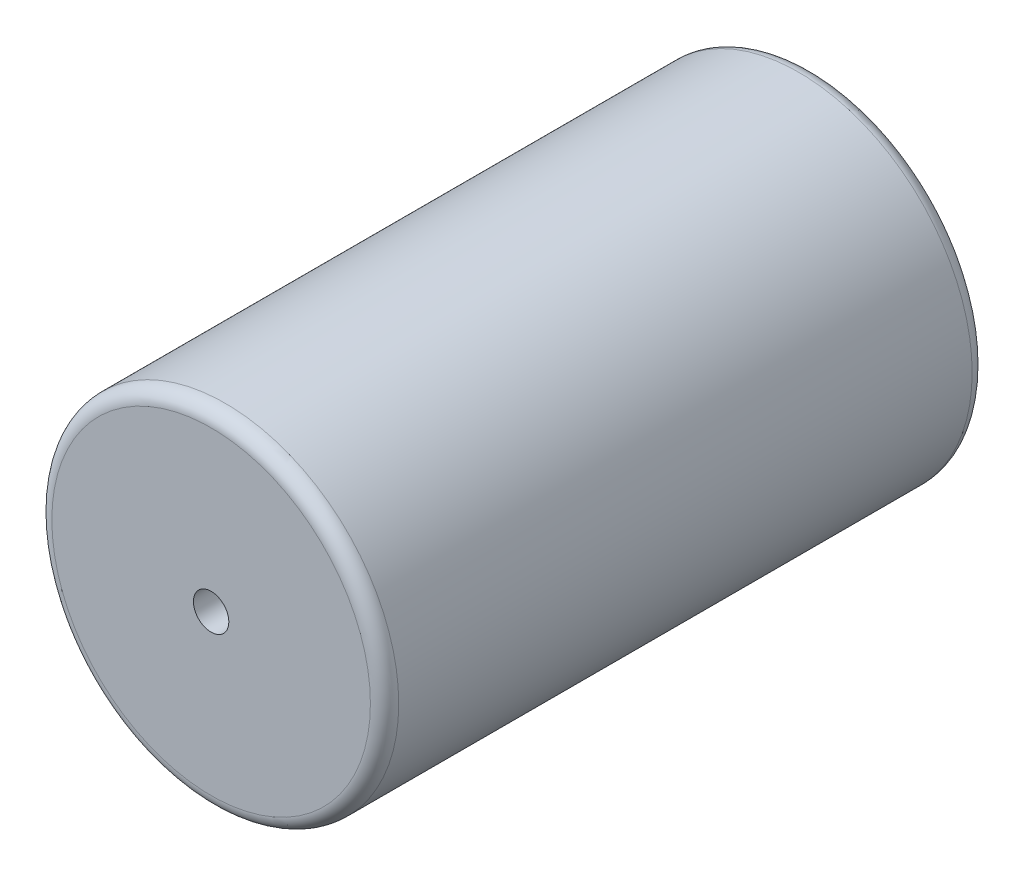
ISO-10303-21;
HEADER;
FILE_DESCRIPTION(('STEP AP214'),'2;1');
FILE_NAME('part.step','',(''),(''),'','','');
FILE_SCHEMA(('AUTOMOTIVE_DESIGN { 1 0 10303 214 1 1 1 1 }'));
ENDSEC;
DATA;
#1=APPLICATION_CONTEXT('core data for automotive mechanical design processes');
#2=APPLICATION_PROTOCOL_DEFINITION('international standard','automotive_design',2000,#1);
#3=PRODUCT_CONTEXT('',#1,'mechanical');
#4=PRODUCT('Part','Part','',(#3));
#5=PRODUCT_RELATED_PRODUCT_CATEGORY('part','',(#4));
#6=PRODUCT_DEFINITION_FORMATION('','',#4);
#7=PRODUCT_DEFINITION_CONTEXT('part definition',#1,'design');
#8=PRODUCT_DEFINITION('design','',#6,#7);
#9=PRODUCT_DEFINITION_SHAPE('','',#8);
#10=(LENGTH_UNIT() NAMED_UNIT(*) SI_UNIT(.MILLI.,.METRE.));
#11=(NAMED_UNIT(*) PLANE_ANGLE_UNIT() SI_UNIT($,.RADIAN.));
#12=(NAMED_UNIT(*) SI_UNIT($,.STERADIAN.) SOLID_ANGLE_UNIT());
#13=UNCERTAINTY_MEASURE_WITH_UNIT(LENGTH_MEASURE(1.E-05),#10,'distance_accuracy_value','');
#14=(GEOMETRIC_REPRESENTATION_CONTEXT(3) GLOBAL_UNCERTAINTY_ASSIGNED_CONTEXT((#13)) GLOBAL_UNIT_ASSIGNED_CONTEXT((#10,
#11,#12)) REPRESENTATION_CONTEXT('',''));
#15=CARTESIAN_POINT('',(0.,0.,0.));
#16=DIRECTION('',(0.,0.,1.));
#17=DIRECTION('',(1.,0.,0.));
#18=AXIS2_PLACEMENT_3D('',#15,#16,#17);
#19=CARTESIAN_POINT('',(0.,0.,85.));
#20=DIRECTION('',(0.,0.,-1.));
#21=DIRECTION('',(-1.,0.,0.));
#22=AXIS2_PLACEMENT_3D('',#19,#20,#21);
#23=CYLINDRICAL_SURFACE('',#22,24.5);
#24=CARTESIAN_POINT('',(0.,0.,2.));
#25=DIRECTION('',(0.,0.,1.));
#26=DIRECTION('',(1.,0.,0.));
#27=AXIS2_PLACEMENT_3D('',#24,#25,#26);
#28=CIRCLE('',#27,24.5);
#29=CARTESIAN_POINT('',(24.5,0.,2.));
#30=VERTEX_POINT('',#29);
#31=EDGE_CURVE('E50',#30,#30,#28,.T.);
#32=ORIENTED_EDGE('',*,*,#31,.T.);
#33=EDGE_LOOP('',(#32));
#34=FACE_BOUND('',#33,.T.);
#35=CARTESIAN_POINT('',(0.,0.,83.));
#36=DIRECTION('',(0.,0.,1.));
#37=DIRECTION('',(1.,0.,0.));
#38=AXIS2_PLACEMENT_3D('',#35,#36,#37);
#39=CIRCLE('',#38,24.5);
#40=CARTESIAN_POINT('',(24.5,0.,83.));
#41=VERTEX_POINT('',#40);
#42=EDGE_CURVE('E54',#41,#41,#39,.F.);
#43=ORIENTED_EDGE('',*,*,#42,.T.);
#44=EDGE_LOOP('',(#43));
#45=FACE_BOUND('',#44,.T.);
#46=ADVANCED_FACE('F39',(#34,#45),#23,.T.);
#47=CARTESIAN_POINT('',(0.,0.,85.));
#48=DIRECTION('',(0.,0.,1.));
#49=DIRECTION('',(1.,0.,0.));
#50=AXIS2_PLACEMENT_3D('',#47,#48,#49);
#51=PLANE('',#50);
#52=CARTESIAN_POINT('',(0.,0.,85.));
#53=DIRECTION('',(0.,0.,1.));
#54=DIRECTION('',(1.,0.,0.));
#55=AXIS2_PLACEMENT_3D('',#52,#53,#54);
#56=CIRCLE('',#55,2.5);
#57=CARTESIAN_POINT('',(2.5,0.,85.));
#58=VERTEX_POINT('',#57);
#59=EDGE_CURVE('E60',#58,#58,#56,.T.);
#60=ORIENTED_EDGE('',*,*,#59,.F.);
#61=EDGE_LOOP('',(#60));
#62=FACE_BOUND('',#61,.T.);
#63=CARTESIAN_POINT('',(0.,0.,85.));
#64=DIRECTION('',(0.,0.,1.));
#65=DIRECTION('',(1.,0.,0.));
#66=AXIS2_PLACEMENT_3D('',#63,#64,#65);
#67=CIRCLE('',#66,22.5);
#68=CARTESIAN_POINT('',(22.5,0.,85.));
#69=VERTEX_POINT('',#68);
#70=EDGE_CURVE('E10',#69,#69,#67,.T.);
#71=ORIENTED_EDGE('',*,*,#70,.T.);
#72=EDGE_LOOP('',(#71));
#73=FACE_BOUND('',#72,.T.);
#74=ADVANCED_FACE('F74',(#62,#73),#51,.T.);
#75=CARTESIAN_POINT('',(0.,0.,0.));
#76=DIRECTION('',(0.,0.,1.));
#77=DIRECTION('',(1.,0.,0.));
#78=AXIS2_PLACEMENT_3D('',#75,#76,#77);
#79=PLANE('',#78);
#80=CARTESIAN_POINT('',(0.,0.,0.));
#81=DIRECTION('',(0.,0.,1.));
#82=DIRECTION('',(1.,0.,0.));
#83=AXIS2_PLACEMENT_3D('',#80,#81,#82);
#84=CIRCLE('',#83,22.5);
#85=CARTESIAN_POINT('',(22.5,0.,0.));
#86=VERTEX_POINT('',#85);
#87=EDGE_CURVE('E46',#86,#86,#84,.F.);
#88=ORIENTED_EDGE('',*,*,#87,.T.);
#89=EDGE_LOOP('',(#88));
#90=FACE_BOUND('',#89,.T.);
#91=ADVANCED_FACE('F76',(#90),#79,.F.);
#92=CARTESIAN_POINT('',(0.,0.,2.));
#93=DIRECTION('',(0.,0.,1.));
#94=DIRECTION('',(1.,0.,0.));
#95=AXIS2_PLACEMENT_3D('',#92,#93,#94);
#96=TOROIDAL_SURFACE('',#95,22.5,2.);
#97=ORIENTED_EDGE('',*,*,#87,.F.);
#98=EDGE_LOOP('',(#97));
#99=FACE_BOUND('',#98,.T.);
#100=ORIENTED_EDGE('',*,*,#31,.F.);
#101=EDGE_LOOP('',(#100));
#102=FACE_BOUND('',#101,.T.);
#103=ADVANCED_FACE('F82',(#99,#102),#96,.T.);
#104=CARTESIAN_POINT('',(0.,0.,83.));
#105=DIRECTION('',(0.,0.,1.));
#106=DIRECTION('',(1.,0.,0.));
#107=AXIS2_PLACEMENT_3D('',#104,#105,#106);
#108=TOROIDAL_SURFACE('',#107,22.5,2.);
#109=ORIENTED_EDGE('',*,*,#42,.F.);
#110=EDGE_LOOP('',(#109));
#111=FACE_BOUND('',#110,.T.);
#112=ORIENTED_EDGE('',*,*,#70,.F.);
#113=EDGE_LOOP('',(#112));
#114=FACE_BOUND('',#113,.T.);
#115=ADVANCED_FACE('F41',(#111,#114),#108,.T.);
#116=CARTESIAN_POINT('',(0.,0.,78.));
#117=DIRECTION('',(0.,0.,1.));
#118=DIRECTION('',(1.,0.,0.));
#119=AXIS2_PLACEMENT_3D('',#116,#117,#118);
#120=CYLINDRICAL_SURFACE('',#119,2.5);
#121=CARTESIAN_POINT('',(0.,0.,78.));
#122=DIRECTION('',(0.,0.,1.));
#123=DIRECTION('',(1.,0.,0.));
#124=AXIS2_PLACEMENT_3D('',#121,#122,#123);
#125=CIRCLE('',#124,2.5);
#126=CARTESIAN_POINT('',(2.5,0.,78.));
#127=VERTEX_POINT('',#126);
#128=EDGE_CURVE('E59',#127,#127,#125,.T.);
#129=ORIENTED_EDGE('',*,*,#128,.F.);
#130=EDGE_LOOP('',(#129));
#131=FACE_BOUND('',#130,.T.);
#132=ORIENTED_EDGE('',*,*,#59,.T.);
#133=EDGE_LOOP('',(#132));
#134=FACE_BOUND('',#133,.T.);
#135=ADVANCED_FACE('F68',(#131,#134),#120,.F.);
#136=CARTESIAN_POINT('',(0.,0.,78.));
#137=DIRECTION('',(0.,0.,1.));
#138=DIRECTION('',(1.,0.,0.));
#139=AXIS2_PLACEMENT_3D('',#136,#137,#138);
#140=PLANE('',#139);
#141=ORIENTED_EDGE('',*,*,#128,.T.);
#142=EDGE_LOOP('',(#141));
#143=FACE_BOUND('',#142,.T.);
#144=ADVANCED_FACE('F66',(#143),#140,.T.);
#145=CLOSED_SHELL('',(#46,#74,#91,#103,#115,#135,#144));
#146=MANIFOLD_SOLID_BREP('B2',#145);
#147=ADVANCED_BREP_SHAPE_REPRESENTATION('',(#18,#146),#14);
#148=SHAPE_DEFINITION_REPRESENTATION(#9,#147);
ENDSEC;
END-ISO-10303-21;
